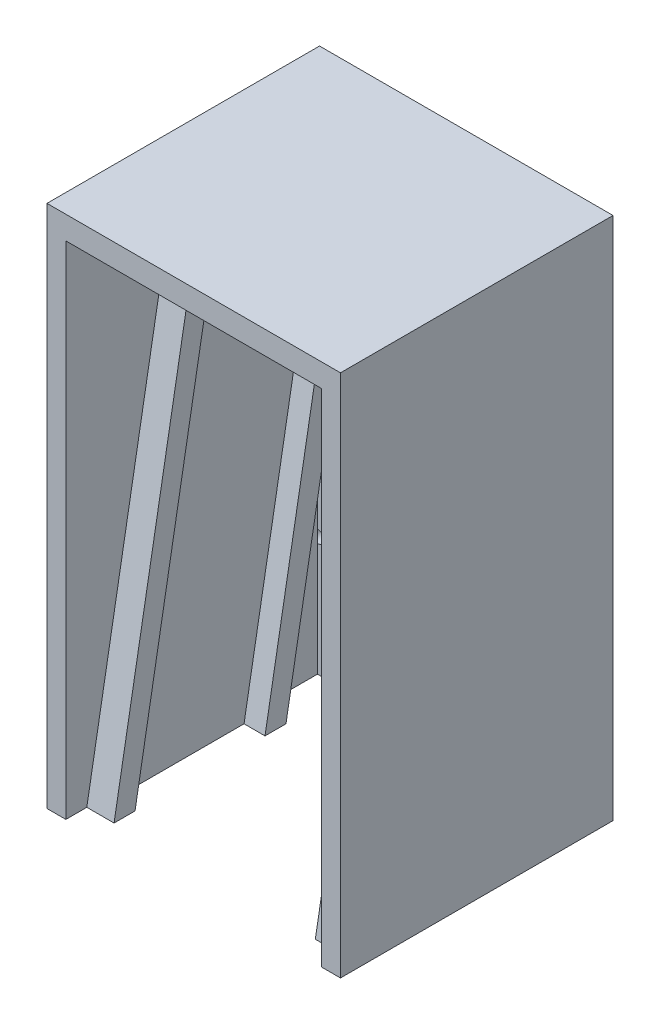
ISO-10303-21;
HEADER;
FILE_DESCRIPTION(('STEP AP214'),'2;1');
FILE_NAME('part.step','',(''),(''),'','','');
FILE_SCHEMA(('AUTOMOTIVE_DESIGN { 1 0 10303 214 1 1 1 1 }'));
ENDSEC;
DATA;
#1=APPLICATION_CONTEXT('core data for automotive mechanical design processes');
#2=APPLICATION_PROTOCOL_DEFINITION('international standard','automotive_design',2000,#1);
#3=PRODUCT_CONTEXT('',#1,'mechanical');
#4=PRODUCT('Part','Part','',(#3));
#5=PRODUCT_RELATED_PRODUCT_CATEGORY('part','',(#4));
#6=PRODUCT_DEFINITION_FORMATION('','',#4);
#7=PRODUCT_DEFINITION_CONTEXT('part definition',#1,'design');
#8=PRODUCT_DEFINITION('design','',#6,#7);
#9=PRODUCT_DEFINITION_SHAPE('','',#8);
#10=(LENGTH_UNIT() NAMED_UNIT(*) SI_UNIT(.MILLI.,.METRE.));
#11=(NAMED_UNIT(*) PLANE_ANGLE_UNIT() SI_UNIT($,.RADIAN.));
#12=(NAMED_UNIT(*) SI_UNIT($,.STERADIAN.) SOLID_ANGLE_UNIT());
#13=UNCERTAINTY_MEASURE_WITH_UNIT(LENGTH_MEASURE(1.E-05),#10,'distance_accuracy_value','');
#14=(GEOMETRIC_REPRESENTATION_CONTEXT(3) GLOBAL_UNCERTAINTY_ASSIGNED_CONTEXT((#13)) GLOBAL_UNIT_ASSIGNED_CONTEXT((#10,
#11,#12)) REPRESENTATION_CONTEXT('',''));
#15=CARTESIAN_POINT('',(0.,0.,0.));
#16=DIRECTION('',(0.,0.,1.));
#17=DIRECTION('',(1.,0.,0.));
#18=AXIS2_PLACEMENT_3D('',#15,#16,#17);
#19=CARTESIAN_POINT('',(36.,71.0305,5.));
#20=DIRECTION('',(0.,-1.,0.));
#21=DIRECTION('',(0.,0.,-1.));
#22=AXIS2_PLACEMENT_3D('',#19,#20,#21);
#23=PLANE('',#22);
#24=DIRECTION('',(0.,0.,1.));
#25=VECTOR('',#24,1.);
#26=CARTESIAN_POINT('',(-35.,71.0305,0.));
#27=LINE('',#26,#25);
#28=CARTESIAN_POINT('',(-35.,71.0305,0.));
#29=VERTEX_POINT('',#28);
#30=CARTESIAN_POINT('',(-35.,71.0305,65.));
#31=VERTEX_POINT('',#30);
#32=EDGE_CURVE('E219',#29,#31,#27,.T.);
#33=ORIENTED_EDGE('',*,*,#32,.T.);
#34=DIRECTION('',(-1.,0.,0.));
#35=VECTOR('',#34,1.);
#36=CARTESIAN_POINT('',(0.,71.0305,65.));
#37=LINE('',#36,#35);
#38=CARTESIAN_POINT('',(35.,71.0305,65.));
#39=VERTEX_POINT('',#38);
#40=EDGE_CURVE('E312',#39,#31,#37,.T.);
#41=ORIENTED_EDGE('',*,*,#40,.F.);
#42=DIRECTION('',(0.,0.,1.));
#43=VECTOR('',#42,1.);
#44=CARTESIAN_POINT('',(35.,71.0305,0.));
#45=LINE('',#44,#43);
#46=CARTESIAN_POINT('',(35.,71.0305,0.));
#47=VERTEX_POINT('',#46);
#48=EDGE_CURVE('E71',#47,#39,#45,.T.);
#49=ORIENTED_EDGE('',*,*,#48,.F.);
#50=DIRECTION('',(-1.,0.,0.));
#51=VECTOR('',#50,1.);
#52=CARTESIAN_POINT('',(36.,71.0305,0.));
#53=LINE('',#52,#51);
#54=EDGE_CURVE('E235',#47,#29,#53,.T.);
#55=ORIENTED_EDGE('',*,*,#54,.T.);
#56=EDGE_LOOP('',(#33,#41,#49,#55));
#57=FACE_BOUND('',#56,.T.);
#58=ADVANCED_FACE('F49',(#57),#23,.F.);
#59=CARTESIAN_POINT('',(36.,-53.9695,5.));
#60=DIRECTION('',(0.,1.,0.));
#61=DIRECTION('',(0.,0.,1.));
#62=AXIS2_PLACEMENT_3D('',#59,#60,#61);
#63=PLANE('',#62);
#64=DIRECTION('',(0.,0.,1.));
#65=VECTOR('',#64,1.);
#66=CARTESIAN_POINT('',(-35.,-53.9695,5.00000000000001));
#67=LINE('',#66,#65);
#68=CARTESIAN_POINT('',(-35.,-53.9695,0.));
#69=VERTEX_POINT('',#68);
#70=CARTESIAN_POINT('',(-35.,-53.9695,65.));
#71=VERTEX_POINT('',#70);
#72=EDGE_CURVE('E64',#69,#71,#67,.T.);
#73=ORIENTED_EDGE('',*,*,#72,.F.);
#74=DIRECTION('',(1.,0.,0.));
#75=VECTOR('',#74,1.);
#76=CARTESIAN_POINT('',(36.,-53.9695,0.));
#77=LINE('',#76,#75);
#78=CARTESIAN_POINT('',(35.,-53.9695,0.));
#79=VERTEX_POINT('',#78);
#80=EDGE_CURVE('E237',#69,#79,#77,.T.);
#81=ORIENTED_EDGE('',*,*,#80,.T.);
#82=DIRECTION('',(0.,0.,1.));
#83=VECTOR('',#82,1.);
#84=CARTESIAN_POINT('',(35.,-53.9695,5.));
#85=LINE('',#84,#83);
#86=CARTESIAN_POINT('',(35.,-53.9695,65.));
#87=VERTEX_POINT('',#86);
#88=EDGE_CURVE('E239',#79,#87,#85,.T.);
#89=ORIENTED_EDGE('',*,*,#88,.T.);
#90=DIRECTION('',(1.,0.,0.));
#91=VECTOR('',#90,1.);
#92=CARTESIAN_POINT('',(0.,-53.9695,65.));
#93=LINE('',#92,#91);
#94=CARTESIAN_POINT('',(30.5,-53.9695,65.));
#95=VERTEX_POINT('',#94);
#96=EDGE_CURVE('E309',#95,#87,#93,.T.);
#97=ORIENTED_EDGE('',*,*,#96,.F.);
#98=DIRECTION('',(0.,0.,-1.));
#99=VECTOR('',#98,1.);
#100=CARTESIAN_POINT('',(30.5,-53.9695,65.));
#101=LINE('',#100,#99);
#102=CARTESIAN_POINT('',(30.5,-53.9695,60.));
#103=VERTEX_POINT('',#102);
#104=EDGE_CURVE('E329',#95,#103,#101,.T.);
#105=ORIENTED_EDGE('',*,*,#104,.T.);
#106=DIRECTION('',(1.,0.,0.));
#107=VECTOR('',#106,1.);
#108=CARTESIAN_POINT('',(0.,-53.9695,60.));
#109=LINE('',#108,#107);
#110=CARTESIAN_POINT('',(24.,-53.9695,60.));
#111=VERTEX_POINT('',#110);
#112=EDGE_CURVE('E600',#111,#103,#109,.T.);
#113=ORIENTED_EDGE('',*,*,#112,.F.);
#114=DIRECTION('',(0.,0.,1.));
#115=VECTOR('',#114,1.);
#116=CARTESIAN_POINT('',(24.,-53.9695,0.));
#117=LINE('',#116,#115);
#118=CARTESIAN_POINT('',(24.,-53.9695,55.));
#119=VERTEX_POINT('',#118);
#120=EDGE_CURVE('E517',#119,#111,#117,.T.);
#121=ORIENTED_EDGE('',*,*,#120,.F.);
#122=DIRECTION('',(1.,0.,0.));
#123=VECTOR('',#122,1.);
#124=CARTESIAN_POINT('',(0.,-53.9695,55.));
#125=LINE('',#124,#123);
#126=CARTESIAN_POINT('',(29.,-53.9695,55.));
#127=VERTEX_POINT('',#126);
#128=EDGE_CURVE('E596',#119,#127,#125,.T.);
#129=ORIENTED_EDGE('',*,*,#128,.T.);
#130=DIRECTION('',(0.,0.,1.));
#131=VECTOR('',#130,1.);
#132=CARTESIAN_POINT('',(29.,-53.9695,0.));
#133=LINE('',#132,#131);
#134=CARTESIAN_POINT('',(29.,-53.9695,24.));
#135=VERTEX_POINT('',#134);
#136=EDGE_CURVE('E591',#135,#127,#133,.T.);
#137=ORIENTED_EDGE('',*,*,#136,.F.);
#138=DIRECTION('',(1.,0.,0.));
#139=VECTOR('',#138,1.);
#140=CARTESIAN_POINT('',(0.,-53.9695,24.));
#141=LINE('',#140,#139);
#142=CARTESIAN_POINT('',(24.,-53.9695,24.));
#143=VERTEX_POINT('',#142);
#144=EDGE_CURVE('E587',#143,#135,#141,.T.);
#145=ORIENTED_EDGE('',*,*,#144,.F.);
#146=CARTESIAN_POINT('',(24.,-53.9695,19.));
#147=VERTEX_POINT('',#146);
#148=EDGE_CURVE('E511',#147,#143,#117,.T.);
#149=ORIENTED_EDGE('',*,*,#148,.F.);
#150=DIRECTION('',(1.,0.,0.));
#151=VECTOR('',#150,1.);
#152=CARTESIAN_POINT('',(0.,-53.9695,19.));
#153=LINE('',#152,#151);
#154=CARTESIAN_POINT('',(30.5,-53.9695,19.));
#155=VERTEX_POINT('',#154);
#156=EDGE_CURVE('E515',#147,#155,#153,.T.);
#157=ORIENTED_EDGE('',*,*,#156,.T.);
#158=CARTESIAN_POINT('',(30.5,-53.9695,5.));
#159=VERTEX_POINT('',#158);
#160=EDGE_CURVE('E327',#155,#159,#101,.T.);
#161=ORIENTED_EDGE('',*,*,#160,.T.);
#162=DIRECTION('',(1.,0.,0.));
#163=VECTOR('',#162,1.);
#164=CARTESIAN_POINT('',(36.,-53.9695,5.));
#165=LINE('',#164,#163);
#166=CARTESIAN_POINT('',(-30.5,-53.9695,5.));
#167=VERTEX_POINT('',#166);
#168=EDGE_CURVE('E246',#167,#159,#165,.T.);
#169=ORIENTED_EDGE('',*,*,#168,.F.);
#170=DIRECTION('',(0.,0.,-1.));
#171=VECTOR('',#170,1.);
#172=CARTESIAN_POINT('',(-30.5,-53.9695,65.));
#173=LINE('',#172,#171);
#174=CARTESIAN_POINT('',(-30.5,-53.9695,19.));
#175=VERTEX_POINT('',#174);
#176=EDGE_CURVE('E317',#175,#167,#173,.T.);
#177=ORIENTED_EDGE('',*,*,#176,.F.);
#178=DIRECTION('',(1.,0.,0.));
#179=VECTOR('',#178,1.);
#180=CARTESIAN_POINT('',(0.,-53.9695,19.));
#181=LINE('',#180,#179);
#182=CARTESIAN_POINT('',(-23.9999999999999,-53.9695,19.));
#183=VERTEX_POINT('',#182);
#184=EDGE_CURVE('E507',#175,#183,#181,.T.);
#185=ORIENTED_EDGE('',*,*,#184,.T.);
#186=DIRECTION('',(0.,0.,1.));
#187=VECTOR('',#186,1.);
#188=CARTESIAN_POINT('',(-23.9999999999999,-53.9695,0.));
#189=LINE('',#188,#187);
#190=CARTESIAN_POINT('',(-23.9999999999999,-53.9695,24.));
#191=VERTEX_POINT('',#190);
#192=EDGE_CURVE('E501',#183,#191,#189,.T.);
#193=ORIENTED_EDGE('',*,*,#192,.T.);
#194=DIRECTION('',(1.,0.,0.));
#195=VECTOR('',#194,1.);
#196=CARTESIAN_POINT('',(0.,-53.9695,24.));
#197=LINE('',#196,#195);
#198=CARTESIAN_POINT('',(-29.,-53.9695,24.));
#199=VERTEX_POINT('',#198);
#200=EDGE_CURVE('E506',#199,#191,#197,.T.);
#201=ORIENTED_EDGE('',*,*,#200,.F.);
#202=DIRECTION('',(0.,0.,1.));
#203=VECTOR('',#202,1.);
#204=CARTESIAN_POINT('',(-29.,-53.9695,0.));
#205=LINE('',#204,#203);
#206=CARTESIAN_POINT('',(-29.,-53.9695,55.));
#207=VERTEX_POINT('',#206);
#208=EDGE_CURVE('E524',#199,#207,#205,.T.);
#209=ORIENTED_EDGE('',*,*,#208,.T.);
#210=DIRECTION('',(1.,0.,0.));
#211=VECTOR('',#210,1.);
#212=CARTESIAN_POINT('',(0.,-53.9695,55.));
#213=LINE('',#212,#211);
#214=CARTESIAN_POINT('',(-23.9999999999999,-53.9695,55.));
#215=VERTEX_POINT('',#214);
#216=EDGE_CURVE('E528',#207,#215,#213,.T.);
#217=ORIENTED_EDGE('',*,*,#216,.T.);
#218=CARTESIAN_POINT('',(-23.9999999999999,-53.9695,60.));
#219=VERTEX_POINT('',#218);
#220=EDGE_CURVE('E509',#215,#219,#189,.T.);
#221=ORIENTED_EDGE('',*,*,#220,.T.);
#222=DIRECTION('',(1.,0.,0.));
#223=VECTOR('',#222,1.);
#224=CARTESIAN_POINT('',(0.,-53.9695,60.));
#225=LINE('',#224,#223);
#226=CARTESIAN_POINT('',(-30.5,-53.9695,60.));
#227=VERTEX_POINT('',#226);
#228=EDGE_CURVE('E532',#227,#219,#225,.T.);
#229=ORIENTED_EDGE('',*,*,#228,.F.);
#230=CARTESIAN_POINT('',(-30.5,-53.9695,65.));
#231=VERTEX_POINT('',#230);
#232=EDGE_CURVE('E322',#231,#227,#173,.T.);
#233=ORIENTED_EDGE('',*,*,#232,.F.);
#234=EDGE_CURVE('E313',#71,#231,#93,.T.);
#235=ORIENTED_EDGE('',*,*,#234,.F.);
#236=EDGE_LOOP('',(#73,#81,#89,#97,#105,#113,#121,#129,#137,#145,#149,#157,#161,#169,#177,#185,
#193,#201,#209,#217,#221,#229,#233,#235));
#237=FACE_BOUND('',#236,.T.);
#238=ADVANCED_FACE('F398',(#237),#63,.F.);
#239=CARTESIAN_POINT('',(0.,0.,0.));
#240=DIRECTION('',(0.,0.,-1.));
#241=DIRECTION('',(-1.,0.,0.));
#242=AXIS2_PLACEMENT_3D('',#239,#240,#241);
#243=PLANE('',#242);
#244=CARTESIAN_POINT('',(-30.5,-25.4695,0.));
#245=DIRECTION('',(0.,0.,1.));
#246=DIRECTION('',(1.,0.,0.));
#247=AXIS2_PLACEMENT_3D('',#244,#245,#246);
#248=CIRCLE('',#247,1.50000000000001);
#249=CARTESIAN_POINT('',(-29.,-25.4695,0.));
#250=VERTEX_POINT('',#249);
#251=EDGE_CURVE('E367',#250,#250,#248,.T.);
#252=ORIENTED_EDGE('',*,*,#251,.T.);
#253=EDGE_LOOP('',(#252));
#254=FACE_BOUND('',#253,.T.);
#255=CARTESIAN_POINT('',(30.5,-25.4695,0.));
#256=DIRECTION('',(0.,0.,1.));
#257=DIRECTION('',(1.,0.,0.));
#258=AXIS2_PLACEMENT_3D('',#255,#256,#257);
#259=CIRCLE('',#258,1.5);
#260=CARTESIAN_POINT('',(32.,-25.4695,0.));
#261=VERTEX_POINT('',#260);
#262=EDGE_CURVE('E358',#261,#261,#259,.T.);
#263=ORIENTED_EDGE('',*,*,#262,.T.);
#264=EDGE_LOOP('',(#263));
#265=FACE_BOUND('',#264,.T.);
#266=CARTESIAN_POINT('',(0.,21.0305,0.));
#267=DIRECTION('',(0.,0.,1.));
#268=DIRECTION('',(1.,0.,0.));
#269=AXIS2_PLACEMENT_3D('',#266,#267,#268);
#270=CIRCLE('',#269,1.5);
#271=CARTESIAN_POINT('',(1.50000000000001,21.0305,0.));
#272=VERTEX_POINT('',#271);
#273=EDGE_CURVE('E345',#272,#272,#270,.T.);
#274=ORIENTED_EDGE('',*,*,#273,.T.);
#275=EDGE_LOOP('',(#274));
#276=FACE_BOUND('',#275,.T.);
#277=CARTESIAN_POINT('',(30.5,67.5305,0.));
#278=DIRECTION('',(0.,0.,1.));
#279=DIRECTION('',(1.,0.,0.));
#280=AXIS2_PLACEMENT_3D('',#277,#278,#279);
#281=CIRCLE('',#280,1.5);
#282=CARTESIAN_POINT('',(32.,67.5305,0.));
#283=VERTEX_POINT('',#282);
#284=EDGE_CURVE('E249',#283,#283,#281,.T.);
#285=ORIENTED_EDGE('',*,*,#284,.T.);
#286=EDGE_LOOP('',(#285));
#287=FACE_BOUND('',#286,.T.);
#288=CARTESIAN_POINT('',(-30.5,67.5305,0.));
#289=DIRECTION('',(0.,0.,1.));
#290=DIRECTION('',(1.,0.,0.));
#291=AXIS2_PLACEMENT_3D('',#288,#289,#290);
#292=CIRCLE('',#291,1.5);
#293=CARTESIAN_POINT('',(-29.,67.5305,0.));
#294=VERTEX_POINT('',#293);
#295=EDGE_CURVE('E242',#294,#294,#292,.T.);
#296=ORIENTED_EDGE('',*,*,#295,.T.);
#297=EDGE_LOOP('',(#296));
#298=FACE_BOUND('',#297,.T.);
#299=ORIENTED_EDGE('',*,*,#80,.F.);
#300=DIRECTION('',(0.,1.,0.));
#301=VECTOR('',#300,1.);
#302=CARTESIAN_POINT('',(-35.,-86.9695000000001,0.));
#303=LINE('',#302,#301);
#304=EDGE_CURVE('E222',#69,#29,#303,.T.);
#305=ORIENTED_EDGE('',*,*,#304,.T.);
#306=ORIENTED_EDGE('',*,*,#54,.F.);
#307=DIRECTION('',(0.,1.,0.));
#308=VECTOR('',#307,1.);
#309=CARTESIAN_POINT('',(35.,-86.9695000000001,0.));
#310=LINE('',#309,#308);
#311=EDGE_CURVE('E228',#79,#47,#310,.T.);
#312=ORIENTED_EDGE('',*,*,#311,.F.);
#313=EDGE_LOOP('',(#299,#305,#306,#312));
#314=FACE_BOUND('',#313,.T.);
#315=ADVANCED_FACE('F233',(#254,#265,#276,#287,#298,#314),#243,.T.);
#316=CARTESIAN_POINT('',(0.,0.,65.));
#317=DIRECTION('',(0.,0.,1.));
#318=DIRECTION('',(1.,0.,0.));
#319=AXIS2_PLACEMENT_3D('',#316,#317,#318);
#320=PLANE('',#319);
#321=ORIENTED_EDGE('',*,*,#40,.T.);
#322=DIRECTION('',(0.,-1.,0.));
#323=VECTOR('',#322,1.);
#324=CARTESIAN_POINT('',(-35.,0.,65.));
#325=LINE('',#324,#323);
#326=EDGE_CURVE('E11',#31,#71,#325,.T.);
#327=ORIENTED_EDGE('',*,*,#326,.T.);
#328=ORIENTED_EDGE('',*,*,#234,.T.);
#329=DIRECTION('',(0.,-1.,0.));
#330=VECTOR('',#329,1.);
#331=CARTESIAN_POINT('',(-30.5,0.,65.));
#332=LINE('',#331,#330);
#333=CARTESIAN_POINT('',(-30.5,65.5305,65.));
#334=VERTEX_POINT('',#333);
#335=EDGE_CURVE('E297',#334,#231,#332,.T.);
#336=ORIENTED_EDGE('',*,*,#335,.F.);
#337=DIRECTION('',(-1.,0.,0.));
#338=VECTOR('',#337,1.);
#339=CARTESIAN_POINT('',(0.,65.5305,65.));
#340=LINE('',#339,#338);
#341=CARTESIAN_POINT('',(30.5,65.5305,65.));
#342=VERTEX_POINT('',#341);
#343=EDGE_CURVE('E301',#342,#334,#340,.T.);
#344=ORIENTED_EDGE('',*,*,#343,.F.);
#345=DIRECTION('',(0.,1.,0.));
#346=VECTOR('',#345,1.);
#347=CARTESIAN_POINT('',(30.5,0.,65.));
#348=LINE('',#347,#346);
#349=EDGE_CURVE('E305',#95,#342,#348,.T.);
#350=ORIENTED_EDGE('',*,*,#349,.F.);
#351=ORIENTED_EDGE('',*,*,#96,.T.);
#352=DIRECTION('',(0.,-1.,0.));
#353=VECTOR('',#352,1.);
#354=CARTESIAN_POINT('',(35.,0.,65.));
#355=LINE('',#354,#353);
#356=EDGE_CURVE('E57',#39,#87,#355,.T.);
#357=ORIENTED_EDGE('',*,*,#356,.F.);
#358=EDGE_LOOP('',(#321,#327,#328,#336,#344,#350,#351,#357));
#359=FACE_BOUND('',#358,.T.);
#360=ADVANCED_FACE('F407',(#359),#320,.T.);
#361=CARTESIAN_POINT('',(0.,65.5305,65.));
#362=DIRECTION('',(0.,-1.,0.));
#363=DIRECTION('',(0.,0.,-1.));
#364=AXIS2_PLACEMENT_3D('',#361,#362,#363);
#365=PLANE('',#364);
#366=DIRECTION('',(-1.,0.,0.));
#367=VECTOR('',#366,1.);
#368=CARTESIAN_POINT('',(0.,65.5305,5.));
#369=LINE('',#368,#367);
#370=CARTESIAN_POINT('',(28.9999999999999,65.5305,5.));
#371=VERTEX_POINT('',#370);
#372=CARTESIAN_POINT('',(-29.0000000000001,65.5305,5.));
#373=VERTEX_POINT('',#372);
#374=EDGE_CURVE('E273',#371,#373,#369,.T.);
#375=ORIENTED_EDGE('',*,*,#374,.F.);
#376=DIRECTION('',(0.,0.,-1.));
#377=VECTOR('',#376,1.);
#378=CARTESIAN_POINT('',(28.9999999999999,65.5305,-23.1858276306314));
#379=LINE('',#378,#377);
#380=CARTESIAN_POINT('',(28.9999999999999,65.5305,33.9289258053393));
#381=VERTEX_POINT('',#380);
#382=EDGE_CURVE('E580',#381,#371,#379,.T.);
#383=ORIENTED_EDGE('',*,*,#382,.F.);
#384=DIRECTION('',(-1.,0.,0.));
#385=VECTOR('',#384,1.);
#386=CARTESIAN_POINT('',(0.,65.5305,33.9289258053393));
#387=LINE('',#386,#385);
#388=CARTESIAN_POINT('',(23.9999999999999,65.5305,33.9289258053393));
#389=VERTEX_POINT('',#388);
#390=EDGE_CURVE('E630',#381,#389,#387,.T.);
#391=ORIENTED_EDGE('',*,*,#390,.T.);
#392=DIRECTION('',(0.,0.,-1.));
#393=VECTOR('',#392,1.);
#394=CARTESIAN_POINT('',(23.9999999999999,65.5305,-23.1858276306314));
#395=LINE('',#394,#393);
#396=CARTESIAN_POINT('',(23.9999999999999,65.5305,38.9289258053393));
#397=VERTEX_POINT('',#396);
#398=EDGE_CURVE('E576',#397,#389,#395,.T.);
#399=ORIENTED_EDGE('',*,*,#398,.F.);
#400=DIRECTION('',(-1.,0.,0.));
#401=VECTOR('',#400,1.);
#402=CARTESIAN_POINT('',(0.,65.5305,38.9289258053393));
#403=LINE('',#402,#401);
#404=CARTESIAN_POINT('',(30.5,65.5305,38.9289258053393));
#405=VERTEX_POINT('',#404);
#406=EDGE_CURVE('E459',#405,#397,#403,.T.);
#407=ORIENTED_EDGE('',*,*,#406,.F.);
#408=DIRECTION('',(0.,0.,-1.));
#409=VECTOR('',#408,1.);
#410=CARTESIAN_POINT('',(30.5,65.5305,65.));
#411=LINE('',#410,#409);
#412=EDGE_CURVE('E333',#342,#405,#411,.T.);
#413=ORIENTED_EDGE('',*,*,#412,.F.);
#414=ORIENTED_EDGE('',*,*,#343,.T.);
#415=DIRECTION('',(0.,0.,-1.));
#416=VECTOR('',#415,1.);
#417=CARTESIAN_POINT('',(-30.5,65.5305,65.));
#418=LINE('',#417,#416);
#419=CARTESIAN_POINT('',(-30.5,65.5305,38.9289258053393));
#420=VERTEX_POINT('',#419);
#421=EDGE_CURVE('E337',#334,#420,#418,.T.);
#422=ORIENTED_EDGE('',*,*,#421,.T.);
#423=DIRECTION('',(-1.,0.,0.));
#424=VECTOR('',#423,1.);
#425=CARTESIAN_POINT('',(0.,65.5305,38.9289258053393));
#426=LINE('',#425,#424);
#427=CARTESIAN_POINT('',(-23.9999999999999,65.5305,38.9289258053393));
#428=VERTEX_POINT('',#427);
#429=EDGE_CURVE('E290',#428,#420,#426,.T.);
#430=ORIENTED_EDGE('',*,*,#429,.F.);
#431=DIRECTION('',(0.,0.,-1.));
#432=VECTOR('',#431,1.);
#433=CARTESIAN_POINT('',(-23.9999999999999,65.5305,-23.1858276306314));
#434=LINE('',#433,#432);
#435=CARTESIAN_POINT('',(-23.9999999999999,65.5305,33.9289258053393));
#436=VERTEX_POINT('',#435);
#437=EDGE_CURVE('E276',#428,#436,#434,.T.);
#438=ORIENTED_EDGE('',*,*,#437,.T.);
#439=DIRECTION('',(-1.,0.,0.));
#440=VECTOR('',#439,1.);
#441=CARTESIAN_POINT('',(0.,65.5305,33.9289258053393));
#442=LINE('',#441,#440);
#443=CARTESIAN_POINT('',(-29.0000000000001,65.5305,33.9289258053393));
#444=VERTEX_POINT('',#443);
#445=EDGE_CURVE('E281',#436,#444,#442,.T.);
#446=ORIENTED_EDGE('',*,*,#445,.T.);
#447=DIRECTION('',(0.,0.,-1.));
#448=VECTOR('',#447,1.);
#449=CARTESIAN_POINT('',(-29.0000000000001,65.5305,-23.1858276306314));
#450=LINE('',#449,#448);
#451=EDGE_CURVE('E287',#444,#373,#450,.T.);
#452=ORIENTED_EDGE('',*,*,#451,.T.);
#453=EDGE_LOOP('',(#375,#383,#391,#399,#407,#413,#414,#422,#430,#438,#446,#452));
#454=FACE_BOUND('',#453,.T.);
#455=ADVANCED_FACE('F415',(#454),#365,.T.);
#456=CARTESIAN_POINT('',(0.,0.,5.));
#457=DIRECTION('',(0.,0.,-1.));
#458=DIRECTION('',(-1.,0.,0.));
#459=AXIS2_PLACEMENT_3D('',#456,#457,#458);
#460=PLANE('',#459);
#461=CARTESIAN_POINT('',(0.,21.0305,5.));
#462=DIRECTION('',(0.,0.,1.));
#463=DIRECTION('',(1.,0.,0.));
#464=AXIS2_PLACEMENT_3D('',#461,#462,#463);
#465=CIRCLE('',#464,1.5);
#466=CARTESIAN_POINT('',(1.50000000000001,21.0305,5.));
#467=VERTEX_POINT('',#466);
#468=EDGE_CURVE('E354',#467,#467,#465,.T.);
#469=ORIENTED_EDGE('',*,*,#468,.F.);
#470=EDGE_LOOP('',(#469));
#471=FACE_BOUND('',#470,.T.);
#472=DIRECTION('',(0.,1.,0.));
#473=VECTOR('',#472,1.);
#474=CARTESIAN_POINT('',(28.9999999999999,77.5238627143953,5.));
#475=LINE('',#474,#473);
#476=CARTESIAN_POINT('',(28.9999999999999,53.7848545727408,5.));
#477=VERTEX_POINT('',#476);
#478=EDGE_CURVE('E570',#477,#371,#475,.T.);
#479=ORIENTED_EDGE('',*,*,#478,.T.);
#480=ORIENTED_EDGE('',*,*,#374,.T.);
#481=DIRECTION('',(0.,1.,0.));
#482=VECTOR('',#481,1.);
#483=CARTESIAN_POINT('',(-29.0000000000001,77.5238627143953,5.));
#484=LINE('',#483,#482);
#485=CARTESIAN_POINT('',(-29.0000000000001,53.7848545727408,5.));
#486=VERTEX_POINT('',#485);
#487=EDGE_CURVE('E469',#486,#373,#484,.T.);
#488=ORIENTED_EDGE('',*,*,#487,.F.);
#489=DIRECTION('',(1.,0.,0.));
#490=VECTOR('',#489,1.);
#491=CARTESIAN_POINT('',(0.,53.7848545727408,5.));
#492=LINE('',#491,#490);
#493=CARTESIAN_POINT('',(-23.9999999999999,53.7848545727408,5.));
#494=VERTEX_POINT('',#493);
#495=EDGE_CURVE('E296',#486,#494,#492,.T.);
#496=ORIENTED_EDGE('',*,*,#495,.T.);
#497=DIRECTION('',(0.,1.,0.));
#498=VECTOR('',#497,1.);
#499=CARTESIAN_POINT('',(-23.9999999999999,77.5238627143953,5.));
#500=LINE('',#499,#498);
#501=CARTESIAN_POINT('',(-23.9999999999999,25.4284454746511,5.));
#502=VERTEX_POINT('',#501);
#503=EDGE_CURVE('E474',#502,#494,#500,.T.);
#504=ORIENTED_EDGE('',*,*,#503,.F.);
#505=DIRECTION('',(1.,0.,0.));
#506=VECTOR('',#505,1.);
#507=CARTESIAN_POINT('',(0.,25.4284454746511,5.));
#508=LINE('',#507,#506);
#509=CARTESIAN_POINT('',(-30.5,25.4284454746511,5.));
#510=VERTEX_POINT('',#509);
#511=EDGE_CURVE('E490',#510,#502,#508,.T.);
#512=ORIENTED_EDGE('',*,*,#511,.F.);
#513=DIRECTION('',(0.,-1.,0.));
#514=VECTOR('',#513,1.);
#515=CARTESIAN_POINT('',(-30.5,0.,5.));
#516=LINE('',#515,#514);
#517=CARTESIAN_POINT('',(-30.5,-23.9695,5.));
#518=VERTEX_POINT('',#517);
#519=EDGE_CURVE('E259',#510,#518,#516,.T.);
#520=ORIENTED_EDGE('',*,*,#519,.T.);
#521=CARTESIAN_POINT('',(-30.5,-25.4695,5.));
#522=DIRECTION('',(0.,0.,1.));
#523=DIRECTION('',(1.,0.,0.));
#524=AXIS2_PLACEMENT_3D('',#521,#522,#523);
#525=CIRCLE('',#524,1.50000000000001);
#526=CARTESIAN_POINT('',(-30.5,-26.9695,5.));
#527=VERTEX_POINT('',#526);
#528=EDGE_CURVE('E350',#527,#518,#525,.T.);
#529=ORIENTED_EDGE('',*,*,#528,.F.);
#530=EDGE_CURVE('E253',#527,#167,#516,.T.);
#531=ORIENTED_EDGE('',*,*,#530,.T.);
#532=ORIENTED_EDGE('',*,*,#168,.T.);
#533=DIRECTION('',(0.,1.,0.));
#534=VECTOR('',#533,1.);
#535=CARTESIAN_POINT('',(30.5,0.,5.));
#536=LINE('',#535,#534);
#537=CARTESIAN_POINT('',(30.5,-26.9695,5.));
#538=VERTEX_POINT('',#537);
#539=EDGE_CURVE('E268',#159,#538,#536,.T.);
#540=ORIENTED_EDGE('',*,*,#539,.T.);
#541=CARTESIAN_POINT('',(30.5,-25.4695,5.));
#542=DIRECTION('',(0.,0.,1.));
#543=DIRECTION('',(1.,0.,0.));
#544=AXIS2_PLACEMENT_3D('',#541,#542,#543);
#545=CIRCLE('',#544,1.5);
#546=CARTESIAN_POINT('',(30.5,-23.9695,5.));
#547=VERTEX_POINT('',#546);
#548=EDGE_CURVE('E362',#547,#538,#545,.T.);
#549=ORIENTED_EDGE('',*,*,#548,.F.);
#550=CARTESIAN_POINT('',(30.5,25.4284454746509,5.00000000000002));
#551=VERTEX_POINT('',#550);
#552=EDGE_CURVE('E257',#547,#551,#536,.T.);
#553=ORIENTED_EDGE('',*,*,#552,.T.);
#554=DIRECTION('',(1.,0.,0.));
#555=VECTOR('',#554,1.);
#556=CARTESIAN_POINT('',(0.,25.4284454746511,5.));
#557=LINE('',#556,#555);
#558=CARTESIAN_POINT('',(24.,25.4284454746511,5.));
#559=VERTEX_POINT('',#558);
#560=EDGE_CURVE('E577',#559,#551,#557,.T.);
#561=ORIENTED_EDGE('',*,*,#560,.F.);
#562=DIRECTION('',(0.,1.,0.));
#563=VECTOR('',#562,1.);
#564=CARTESIAN_POINT('',(23.9999999999999,77.5238627143953,5.));
#565=LINE('',#564,#563);
#566=CARTESIAN_POINT('',(23.9999999999999,53.7848545727408,5.));
#567=VERTEX_POINT('',#566);
#568=EDGE_CURVE('E583',#559,#567,#565,.T.);
#569=ORIENTED_EDGE('',*,*,#568,.T.);
#570=DIRECTION('',(1.,0.,0.));
#571=VECTOR('',#570,1.);
#572=CARTESIAN_POINT('',(0.,53.7848545727408,5.));
#573=LINE('',#572,#571);
#574=EDGE_CURVE('E519',#567,#477,#573,.T.);
#575=ORIENTED_EDGE('',*,*,#574,.T.);
#576=EDGE_LOOP('',(#479,#480,#488,#496,#504,#512,#520,#529,#531,#532,#540,#549,#553,#561,#569,#575));
#577=FACE_BOUND('',#576,.T.);
#578=ADVANCED_FACE('F411',(#471,#577),#460,.F.);
#579=CARTESIAN_POINT('',(30.5,0.,65.));
#580=DIRECTION('',(-1.,0.,0.));
#581=DIRECTION('',(0.,-1.,0.));
#582=AXIS2_PLACEMENT_3D('',#579,#580,#581);
#583=PLANE('',#582);
#584=ORIENTED_EDGE('',*,*,#412,.T.);
#585=DIRECTION('',(0.,-0.984807753012209,0.173648177666924));
#586=VECTOR('',#585,1.);
#587=CARTESIAN_POINT('',(30.5,77.5238627143953,36.8141723693685));
#588=LINE('',#587,#586);
#589=EDGE_CURVE('E453',#405,#103,#588,.T.);
#590=ORIENTED_EDGE('',*,*,#589,.T.);
#591=ORIENTED_EDGE('',*,*,#104,.F.);
#592=ORIENTED_EDGE('',*,*,#349,.T.);
#593=EDGE_LOOP('',(#584,#590,#591,#592));
#594=FACE_BOUND('',#593,.T.);
#595=ADVANCED_FACE('F414',(#594),#583,.T.);
#596=CARTESIAN_POINT('',(-30.5,0.,65.));
#597=DIRECTION('',(1.,0.,0.));
#598=DIRECTION('',(0.,1.,0.));
#599=AXIS2_PLACEMENT_3D('',#596,#597,#598);
#600=PLANE('',#599);
#601=ORIENTED_EDGE('',*,*,#232,.T.);
#602=DIRECTION('',(0.,-0.984807753012209,0.173648177666924));
#603=VECTOR('',#602,1.);
#604=CARTESIAN_POINT('',(-30.5,77.5238627143953,36.8141723693685));
#605=LINE('',#604,#603);
#606=EDGE_CURVE('E461',#420,#227,#605,.T.);
#607=ORIENTED_EDGE('',*,*,#606,.F.);
#608=ORIENTED_EDGE('',*,*,#421,.F.);
#609=ORIENTED_EDGE('',*,*,#335,.T.);
#610=EDGE_LOOP('',(#601,#607,#608,#609));
#611=FACE_BOUND('',#610,.T.);
#612=ADVANCED_FACE('F420',(#611),#600,.T.);
#613=CARTESIAN_POINT('',(-30.5,67.5305,5.));
#614=DIRECTION('',(0.,0.,-1.));
#615=DIRECTION('',(-1.,0.,0.));
#616=AXIS2_PLACEMENT_3D('',#613,#614,#615);
#617=CYLINDRICAL_SURFACE('',#616,1.5);
#618=CARTESIAN_POINT('',(-30.5,67.5305,5.));
#619=DIRECTION('',(0.,0.,1.));
#620=DIRECTION('',(1.,0.,0.));
#621=AXIS2_PLACEMENT_3D('',#618,#619,#620);
#622=CIRCLE('',#621,1.5);
#623=CARTESIAN_POINT('',(-29.,67.5305,5.));
#624=VERTEX_POINT('',#623);
#625=EDGE_CURVE('E341',#624,#624,#622,.T.);
#626=ORIENTED_EDGE('',*,*,#625,.T.);
#627=EDGE_LOOP('',(#626));
#628=FACE_BOUND('',#627,.T.);
#629=ORIENTED_EDGE('',*,*,#295,.F.);
#630=EDGE_LOOP('',(#629));
#631=FACE_BOUND('',#630,.T.);
#632=ADVANCED_FACE('F379',(#628,#631),#617,.F.);
#633=CARTESIAN_POINT('',(30.5,67.5305,5.));
#634=DIRECTION('',(0.,0.,-1.));
#635=DIRECTION('',(-1.,0.,0.));
#636=AXIS2_PLACEMENT_3D('',#633,#634,#635);
#637=CYLINDRICAL_SURFACE('',#636,1.5);
#638=CARTESIAN_POINT('',(30.5,67.5305,5.));
#639=DIRECTION('',(0.,0.,1.));
#640=DIRECTION('',(1.,0.,0.));
#641=AXIS2_PLACEMENT_3D('',#638,#639,#640);
#642=CIRCLE('',#641,1.5);
#643=CARTESIAN_POINT('',(32.,67.5305,5.));
#644=VERTEX_POINT('',#643);
#645=EDGE_CURVE('E346',#644,#644,#642,.T.);
#646=ORIENTED_EDGE('',*,*,#645,.T.);
#647=EDGE_LOOP('',(#646));
#648=FACE_BOUND('',#647,.T.);
#649=ORIENTED_EDGE('',*,*,#284,.F.);
#650=EDGE_LOOP('',(#649));
#651=FACE_BOUND('',#650,.T.);
#652=ADVANCED_FACE('F419',(#648,#651),#637,.F.);
#653=CARTESIAN_POINT('',(0.,21.0305,5.));
#654=DIRECTION('',(0.,0.,-1.));
#655=DIRECTION('',(-1.,0.,0.));
#656=AXIS2_PLACEMENT_3D('',#653,#654,#655);
#657=CYLINDRICAL_SURFACE('',#656,1.5);
#658=ORIENTED_EDGE('',*,*,#468,.T.);
#659=EDGE_LOOP('',(#658));
#660=FACE_BOUND('',#659,.T.);
#661=ORIENTED_EDGE('',*,*,#273,.F.);
#662=EDGE_LOOP('',(#661));
#663=FACE_BOUND('',#662,.T.);
#664=ADVANCED_FACE('F429',(#660,#663),#657,.F.);
#665=CARTESIAN_POINT('',(30.5,-25.4695,5.));
#666=DIRECTION('',(0.,0.,-1.));
#667=DIRECTION('',(-1.,0.,0.));
#668=AXIS2_PLACEMENT_3D('',#665,#666,#667);
#669=CYLINDRICAL_SURFACE('',#668,1.5);
#670=ORIENTED_EDGE('',*,*,#548,.T.);
#671=EDGE_CURVE('E366',#538,#547,#545,.T.);
#672=ORIENTED_EDGE('',*,*,#671,.T.);
#673=EDGE_LOOP('',(#670,#672));
#674=FACE_BOUND('',#673,.T.);
#675=ORIENTED_EDGE('',*,*,#262,.F.);
#676=EDGE_LOOP('',(#675));
#677=FACE_BOUND('',#676,.T.);
#678=ADVANCED_FACE('F425',(#674,#677),#669,.F.);
#679=CARTESIAN_POINT('',(-30.5,-25.4695,5.));
#680=DIRECTION('',(0.,0.,-1.));
#681=DIRECTION('',(-1.,0.,0.));
#682=AXIS2_PLACEMENT_3D('',#679,#680,#681);
#683=CYLINDRICAL_SURFACE('',#682,1.50000000000001);
#684=EDGE_CURVE('E371',#518,#527,#525,.T.);
#685=ORIENTED_EDGE('',*,*,#684,.T.);
#686=ORIENTED_EDGE('',*,*,#528,.T.);
#687=EDGE_LOOP('',(#685,#686));
#688=FACE_BOUND('',#687,.T.);
#689=ORIENTED_EDGE('',*,*,#251,.F.);
#690=EDGE_LOOP('',(#689));
#691=FACE_BOUND('',#690,.T.);
#692=ADVANCED_FACE('F421',(#688,#691),#683,.F.);
#693=DIRECTION('',(0.,-0.984807753012209,0.173648177666924));
#694=VECTOR('',#693,1.);
#695=CARTESIAN_POINT('',(30.5,77.5238627143953,-4.18582763063143));
#696=LINE('',#695,#694);
#697=EDGE_CURVE('E607',#551,#155,#696,.T.);
#698=ORIENTED_EDGE('',*,*,#697,.F.);
#699=ORIENTED_EDGE('',*,*,#552,.F.);
#700=EDGE_CURVE('E269',#538,#547,#536,.T.);
#701=ORIENTED_EDGE('',*,*,#700,.F.);
#702=ORIENTED_EDGE('',*,*,#539,.F.);
#703=ORIENTED_EDGE('',*,*,#160,.F.);
#704=EDGE_LOOP('',(#698,#699,#701,#702,#703));
#705=FACE_BOUND('',#704,.T.);
#706=ADVANCED_FACE('F424',(#705),#583,.T.);
#707=DIRECTION('',(0.,-0.984807753012209,0.173648177666924));
#708=VECTOR('',#707,1.);
#709=CARTESIAN_POINT('',(-30.5,77.5238627143953,-4.18582763063143));
#710=LINE('',#709,#708);
#711=EDGE_CURVE('E495',#510,#175,#710,.T.);
#712=ORIENTED_EDGE('',*,*,#711,.T.);
#713=ORIENTED_EDGE('',*,*,#176,.T.);
#714=ORIENTED_EDGE('',*,*,#530,.F.);
#715=EDGE_CURVE('E260',#518,#527,#516,.T.);
#716=ORIENTED_EDGE('',*,*,#715,.F.);
#717=ORIENTED_EDGE('',*,*,#519,.F.);
#718=EDGE_LOOP('',(#712,#713,#714,#716,#717));
#719=FACE_BOUND('',#718,.T.);
#720=ADVANCED_FACE('F437',(#719),#600,.T.);
#721=CARTESIAN_POINT('',(0.,0.,5.));
#722=DIRECTION('',(0.,0.,1.));
#723=DIRECTION('',(1.,0.,0.));
#724=AXIS2_PLACEMENT_3D('',#721,#722,#723);
#725=PLANE('',#724);
#726=ORIENTED_EDGE('',*,*,#671,.F.);
#727=ORIENTED_EDGE('',*,*,#700,.T.);
#728=EDGE_LOOP('',(#726,#727));
#729=FACE_BOUND('',#728,.T.);
#730=ADVANCED_FACE('F393',(#729),#725,.F.);
#731=ORIENTED_EDGE('',*,*,#684,.F.);
#732=ORIENTED_EDGE('',*,*,#715,.T.);
#733=EDGE_LOOP('',(#731,#732));
#734=FACE_BOUND('',#733,.T.);
#735=ADVANCED_FACE('F385',(#734),#725,.F.);
#736=ORIENTED_EDGE('',*,*,#625,.F.);
#737=EDGE_LOOP('',(#736));
#738=FACE_BOUND('',#737,.T.);
#739=ADVANCED_FACE('F382',(#738),#725,.F.);
#740=ORIENTED_EDGE('',*,*,#645,.F.);
#741=EDGE_LOOP('',(#740));
#742=FACE_BOUND('',#741,.T.);
#743=ADVANCED_FACE('F384',(#742),#725,.F.);
#744=CARTESIAN_POINT('',(0.,77.5238627143953,36.8141723693685));
#745=DIRECTION('',(0.,-0.173648177666924,-0.984807753012209));
#746=DIRECTION('',(0.,0.984807753012209,-0.173648177666924));
#747=AXIS2_PLACEMENT_3D('',#744,#745,#746);
#748=PLANE('',#747);
#749=DIRECTION('',(0.,-0.984807753012209,0.173648177666924));
#750=VECTOR('',#749,1.);
#751=CARTESIAN_POINT('',(-23.9999999999999,77.5238627143953,36.8141723693685));
#752=LINE('',#751,#750);
#753=EDGE_CURVE('E467',#428,#219,#752,.T.);
#754=ORIENTED_EDGE('',*,*,#753,.F.);
#755=ORIENTED_EDGE('',*,*,#429,.T.);
#756=ORIENTED_EDGE('',*,*,#606,.T.);
#757=ORIENTED_EDGE('',*,*,#228,.T.);
#758=EDGE_LOOP('',(#754,#755,#756,#757));
#759=FACE_BOUND('',#758,.T.);
#760=ADVANCED_FACE('F391',(#759),#748,.F.);
#761=CARTESIAN_POINT('',(-24.,77.5238627143953,-23.1858276306314));
#762=DIRECTION('',(1.,0.,0.));
#763=DIRECTION('',(0.,1.,0.));
#764=AXIS2_PLACEMENT_3D('',#761,#762,#763);
#765=PLANE('',#764);
#766=ORIENTED_EDGE('',*,*,#437,.F.);
#767=ORIENTED_EDGE('',*,*,#753,.T.);
#768=ORIENTED_EDGE('',*,*,#220,.F.);
#769=DIRECTION('',(0.,-0.984807753012209,0.173648177666924));
#770=VECTOR('',#769,1.);
#771=CARTESIAN_POINT('',(-23.9999999999999,77.5238627143953,31.8141723693685));
#772=LINE('',#771,#770);
#773=EDGE_CURVE('E541',#436,#215,#772,.T.);
#774=ORIENTED_EDGE('',*,*,#773,.F.);
#775=EDGE_LOOP('',(#766,#767,#768,#774));
#776=FACE_BOUND('',#775,.T.);
#777=ADVANCED_FACE('F563',(#776),#765,.T.);
#778=CARTESIAN_POINT('',(0.,77.5238627143953,31.8141723693686));
#779=DIRECTION('',(0.,-0.173648177666924,-0.984807753012209));
#780=DIRECTION('',(0.,0.984807753012209,-0.173648177666924));
#781=AXIS2_PLACEMENT_3D('',#778,#779,#780);
#782=PLANE('',#781);
#783=ORIENTED_EDGE('',*,*,#445,.F.);
#784=ORIENTED_EDGE('',*,*,#773,.T.);
#785=ORIENTED_EDGE('',*,*,#216,.F.);
#786=DIRECTION('',(0.,-0.984807753012209,0.173648177666924));
#787=VECTOR('',#786,1.);
#788=CARTESIAN_POINT('',(-29.0000000000001,77.5238627143953,31.8141723693685));
#789=LINE('',#788,#787);
#790=EDGE_CURVE('E544',#444,#207,#789,.T.);
#791=ORIENTED_EDGE('',*,*,#790,.F.);
#792=EDGE_LOOP('',(#783,#784,#785,#791));
#793=FACE_BOUND('',#792,.T.);
#794=ADVANCED_FACE('F560',(#793),#782,.T.);
#795=CARTESIAN_POINT('',(-29.0000000000001,77.5238627143953,-23.1858276306314));
#796=DIRECTION('',(1.,0.,0.));
#797=DIRECTION('',(0.,1.,0.));
#798=AXIS2_PLACEMENT_3D('',#795,#796,#797);
#799=PLANE('',#798);
#800=ORIENTED_EDGE('',*,*,#451,.F.);
#801=ORIENTED_EDGE('',*,*,#790,.T.);
#802=ORIENTED_EDGE('',*,*,#208,.F.);
#803=DIRECTION('',(0.,-0.984807753012209,0.173648177666924));
#804=VECTOR('',#803,1.);
#805=CARTESIAN_POINT('',(-29.0000000000001,77.5238627143953,0.814172369368572));
#806=LINE('',#805,#804);
#807=EDGE_CURVE('E484',#486,#199,#806,.T.);
#808=ORIENTED_EDGE('',*,*,#807,.F.);
#809=ORIENTED_EDGE('',*,*,#487,.T.);
#810=EDGE_LOOP('',(#800,#801,#802,#808,#809));
#811=FACE_BOUND('',#810,.T.);
#812=ADVANCED_FACE('F554',(#811),#799,.T.);
#813=CARTESIAN_POINT('',(0.,77.5238627143953,0.814172369368572));
#814=DIRECTION('',(0.,-0.173648177666924,-0.984807753012209));
#815=DIRECTION('',(0.,0.984807753012209,-0.173648177666924));
#816=AXIS2_PLACEMENT_3D('',#813,#814,#815);
#817=PLANE('',#816);
#818=ORIENTED_EDGE('',*,*,#495,.F.);
#819=ORIENTED_EDGE('',*,*,#807,.T.);
#820=ORIENTED_EDGE('',*,*,#200,.T.);
#821=DIRECTION('',(0.,-0.984807753012209,0.173648177666924));
#822=VECTOR('',#821,1.);
#823=CARTESIAN_POINT('',(-23.9999999999999,77.5238627143953,0.814172369368572));
#824=LINE('',#823,#822);
#825=EDGE_CURVE('E476',#494,#191,#824,.T.);
#826=ORIENTED_EDGE('',*,*,#825,.F.);
#827=EDGE_LOOP('',(#818,#819,#820,#826));
#828=FACE_BOUND('',#827,.T.);
#829=ADVANCED_FACE('F551',(#828),#817,.F.);
#830=DIRECTION('',(0.,-0.984807753012209,0.173648177666924));
#831=VECTOR('',#830,1.);
#832=CARTESIAN_POINT('',(-24.,77.5238627143953,-4.18582763063143));
#833=LINE('',#832,#831);
#834=EDGE_CURVE('E470',#502,#183,#833,.T.);
#835=ORIENTED_EDGE('',*,*,#834,.F.);
#836=ORIENTED_EDGE('',*,*,#503,.T.);
#837=ORIENTED_EDGE('',*,*,#825,.T.);
#838=ORIENTED_EDGE('',*,*,#192,.F.);
#839=EDGE_LOOP('',(#835,#836,#837,#838));
#840=FACE_BOUND('',#839,.T.);
#841=ADVANCED_FACE('F498',(#840),#765,.T.);
#842=CARTESIAN_POINT('',(0.,77.5238627143953,-4.18582763063143));
#843=DIRECTION('',(0.,-0.173648177666924,-0.984807753012209));
#844=DIRECTION('',(0.,0.984807753012209,-0.173648177666924));
#845=AXIS2_PLACEMENT_3D('',#842,#843,#844);
#846=PLANE('',#845);
#847=ORIENTED_EDGE('',*,*,#711,.F.);
#848=ORIENTED_EDGE('',*,*,#511,.T.);
#849=ORIENTED_EDGE('',*,*,#834,.T.);
#850=ORIENTED_EDGE('',*,*,#184,.F.);
#851=EDGE_LOOP('',(#847,#848,#849,#850));
#852=FACE_BOUND('',#851,.T.);
#853=ADVANCED_FACE('F394',(#852),#846,.T.);
#854=CARTESIAN_POINT('',(0.,77.5238627143953,0.814172369368572));
#855=DIRECTION('',(0.,-0.173648177666924,-0.984807753012209));
#856=DIRECTION('',(0.,0.984807753012209,-0.173648177666924));
#857=AXIS2_PLACEMENT_3D('',#854,#855,#856);
#858=PLANE('',#857);
#859=ORIENTED_EDGE('',*,*,#574,.F.);
#860=DIRECTION('',(0.,-0.984807753012209,0.173648177666924));
#861=VECTOR('',#860,1.);
#862=CARTESIAN_POINT('',(23.9999999999999,77.5238627143953,0.814172369368572));
#863=LINE('',#862,#861);
#864=EDGE_CURVE('E592',#567,#143,#863,.T.);
#865=ORIENTED_EDGE('',*,*,#864,.T.);
#866=ORIENTED_EDGE('',*,*,#144,.T.);
#867=DIRECTION('',(0.,-0.984807753012209,0.173648177666924));
#868=VECTOR('',#867,1.);
#869=CARTESIAN_POINT('',(28.9999999999999,77.5238627143953,0.814172369368572));
#870=LINE('',#869,#868);
#871=EDGE_CURVE('E622',#477,#135,#870,.T.);
#872=ORIENTED_EDGE('',*,*,#871,.F.);
#873=EDGE_LOOP('',(#859,#865,#866,#872));
#874=FACE_BOUND('',#873,.T.);
#875=ADVANCED_FACE('F676',(#874),#858,.F.);
#876=CARTESIAN_POINT('',(28.9999999999999,77.5238627143953,-23.1858276306314));
#877=DIRECTION('',(1.,0.,0.));
#878=DIRECTION('',(0.,1.,0.));
#879=AXIS2_PLACEMENT_3D('',#876,#877,#878);
#880=PLANE('',#879);
#881=DIRECTION('',(0.,-0.984807753012209,0.173648177666924));
#882=VECTOR('',#881,1.);
#883=CARTESIAN_POINT('',(28.9999999999999,77.5238627143953,31.8141723693686));
#884=LINE('',#883,#882);
#885=EDGE_CURVE('E619',#381,#127,#884,.T.);
#886=ORIENTED_EDGE('',*,*,#885,.F.);
#887=ORIENTED_EDGE('',*,*,#382,.T.);
#888=ORIENTED_EDGE('',*,*,#478,.F.);
#889=ORIENTED_EDGE('',*,*,#871,.T.);
#890=ORIENTED_EDGE('',*,*,#136,.T.);
#891=EDGE_LOOP('',(#886,#887,#888,#889,#890));
#892=FACE_BOUND('',#891,.T.);
#893=ADVANCED_FACE('F681',(#892),#880,.F.);
#894=CARTESIAN_POINT('',(0.,77.5238627143953,31.8141723693686));
#895=DIRECTION('',(0.,-0.173648177666924,-0.984807753012209));
#896=DIRECTION('',(0.,0.984807753012209,-0.173648177666924));
#897=AXIS2_PLACEMENT_3D('',#894,#895,#896);
#898=PLANE('',#897);
#899=ORIENTED_EDGE('',*,*,#390,.F.);
#900=ORIENTED_EDGE('',*,*,#885,.T.);
#901=ORIENTED_EDGE('',*,*,#128,.F.);
#902=DIRECTION('',(0.,-0.984807753012209,0.173648177666924));
#903=VECTOR('',#902,1.);
#904=CARTESIAN_POINT('',(23.9999999999999,77.5238627143953,31.8141723693686));
#905=LINE('',#904,#903);
#906=EDGE_CURVE('E616',#389,#119,#905,.T.);
#907=ORIENTED_EDGE('',*,*,#906,.F.);
#908=EDGE_LOOP('',(#899,#900,#901,#907));
#909=FACE_BOUND('',#908,.T.);
#910=ADVANCED_FACE('F683',(#909),#898,.T.);
#911=CARTESIAN_POINT('',(23.9999999999999,77.5238627143953,-23.1858276306314));
#912=DIRECTION('',(1.,0.,0.));
#913=DIRECTION('',(0.,1.,0.));
#914=AXIS2_PLACEMENT_3D('',#911,#912,#913);
#915=PLANE('',#914);
#916=DIRECTION('',(0.,-0.984807753012209,0.173648177666924));
#917=VECTOR('',#916,1.);
#918=CARTESIAN_POINT('',(23.9999999999999,77.5238627143953,36.8141723693685));
#919=LINE('',#918,#917);
#920=EDGE_CURVE('E613',#397,#111,#919,.T.);
#921=ORIENTED_EDGE('',*,*,#920,.F.);
#922=ORIENTED_EDGE('',*,*,#398,.T.);
#923=ORIENTED_EDGE('',*,*,#906,.T.);
#924=ORIENTED_EDGE('',*,*,#120,.T.);
#925=EDGE_LOOP('',(#921,#922,#923,#924));
#926=FACE_BOUND('',#925,.T.);
#927=ADVANCED_FACE('F687',(#926),#915,.F.);
#928=CARTESIAN_POINT('',(0.,77.5238627143953,36.8141723693685));
#929=DIRECTION('',(0.,-0.173648177666924,-0.984807753012209));
#930=DIRECTION('',(0.,0.984807753012209,-0.173648177666924));
#931=AXIS2_PLACEMENT_3D('',#928,#929,#930);
#932=PLANE('',#931);
#933=ORIENTED_EDGE('',*,*,#589,.F.);
#934=ORIENTED_EDGE('',*,*,#406,.T.);
#935=ORIENTED_EDGE('',*,*,#920,.T.);
#936=ORIENTED_EDGE('',*,*,#112,.T.);
#937=EDGE_LOOP('',(#933,#934,#935,#936));
#938=FACE_BOUND('',#937,.T.);
#939=ADVANCED_FACE('F691',(#938),#932,.F.);
#940=CARTESIAN_POINT('',(0.,77.5238627143953,-4.18582763063143));
#941=DIRECTION('',(0.,-0.173648177666924,-0.984807753012209));
#942=DIRECTION('',(0.,0.984807753012209,-0.173648177666924));
#943=AXIS2_PLACEMENT_3D('',#940,#941,#942);
#944=PLANE('',#943);
#945=DIRECTION('',(0.,-0.984807753012209,0.173648177666924));
#946=VECTOR('',#945,1.);
#947=CARTESIAN_POINT('',(23.9999999999999,77.5238627143953,-4.18582763063143));
#948=LINE('',#947,#946);
#949=EDGE_CURVE('E586',#559,#147,#948,.T.);
#950=ORIENTED_EDGE('',*,*,#949,.F.);
#951=ORIENTED_EDGE('',*,*,#560,.T.);
#952=ORIENTED_EDGE('',*,*,#697,.T.);
#953=ORIENTED_EDGE('',*,*,#156,.F.);
#954=EDGE_LOOP('',(#950,#951,#952,#953));
#955=FACE_BOUND('',#954,.T.);
#956=ADVANCED_FACE('F668',(#955),#944,.T.);
#957=ORIENTED_EDGE('',*,*,#568,.F.);
#958=ORIENTED_EDGE('',*,*,#949,.T.);
#959=ORIENTED_EDGE('',*,*,#148,.T.);
#960=ORIENTED_EDGE('',*,*,#864,.F.);
#961=EDGE_LOOP('',(#957,#958,#959,#960));
#962=FACE_BOUND('',#961,.T.);
#963=ADVANCED_FACE('F672',(#962),#915,.F.);
#964=CARTESIAN_POINT('',(35.,-86.9695000000001,0.));
#965=DIRECTION('',(-1.,0.,0.));
#966=DIRECTION('',(0.,0.,1.));
#967=AXIS2_PLACEMENT_3D('',#964,#965,#966);
#968=PLANE('',#967);
#969=ORIENTED_EDGE('',*,*,#311,.T.);
#970=ORIENTED_EDGE('',*,*,#48,.T.);
#971=ORIENTED_EDGE('',*,*,#356,.T.);
#972=ORIENTED_EDGE('',*,*,#88,.F.);
#973=EDGE_LOOP('',(#969,#970,#971,#972));
#974=FACE_BOUND('',#973,.T.);
#975=ADVANCED_FACE('F693',(#974),#968,.F.);
#976=CARTESIAN_POINT('',(-35.,-86.9695000000001,0.));
#977=DIRECTION('',(-1.,0.,0.));
#978=DIRECTION('',(0.,0.,1.));
#979=AXIS2_PLACEMENT_3D('',#976,#977,#978);
#980=PLANE('',#979);
#981=ORIENTED_EDGE('',*,*,#72,.T.);
#982=ORIENTED_EDGE('',*,*,#326,.F.);
#983=ORIENTED_EDGE('',*,*,#32,.F.);
#984=ORIENTED_EDGE('',*,*,#304,.F.);
#985=EDGE_LOOP('',(#981,#982,#983,#984));
#986=FACE_BOUND('',#985,.T.);
#987=ADVANCED_FACE('F221',(#986),#980,.T.);
#988=CLOSED_SHELL('',(#58,#238,#315,#360,#455,#578,#595,#612,#632,#652,#664,#678,#692,#706,#720,
#730,#735,#739,#743,#760,#777,#794,#812,#829,#841,#853,#875,#893,#910,#927,#939,#956,#963,#975,#987));
#989=MANIFOLD_SOLID_BREP('B2',#988);
#990=ADVANCED_BREP_SHAPE_REPRESENTATION('',(#18,#989),#14);
#991=SHAPE_DEFINITION_REPRESENTATION(#9,#990);
ENDSEC;
END-ISO-10303-21;
